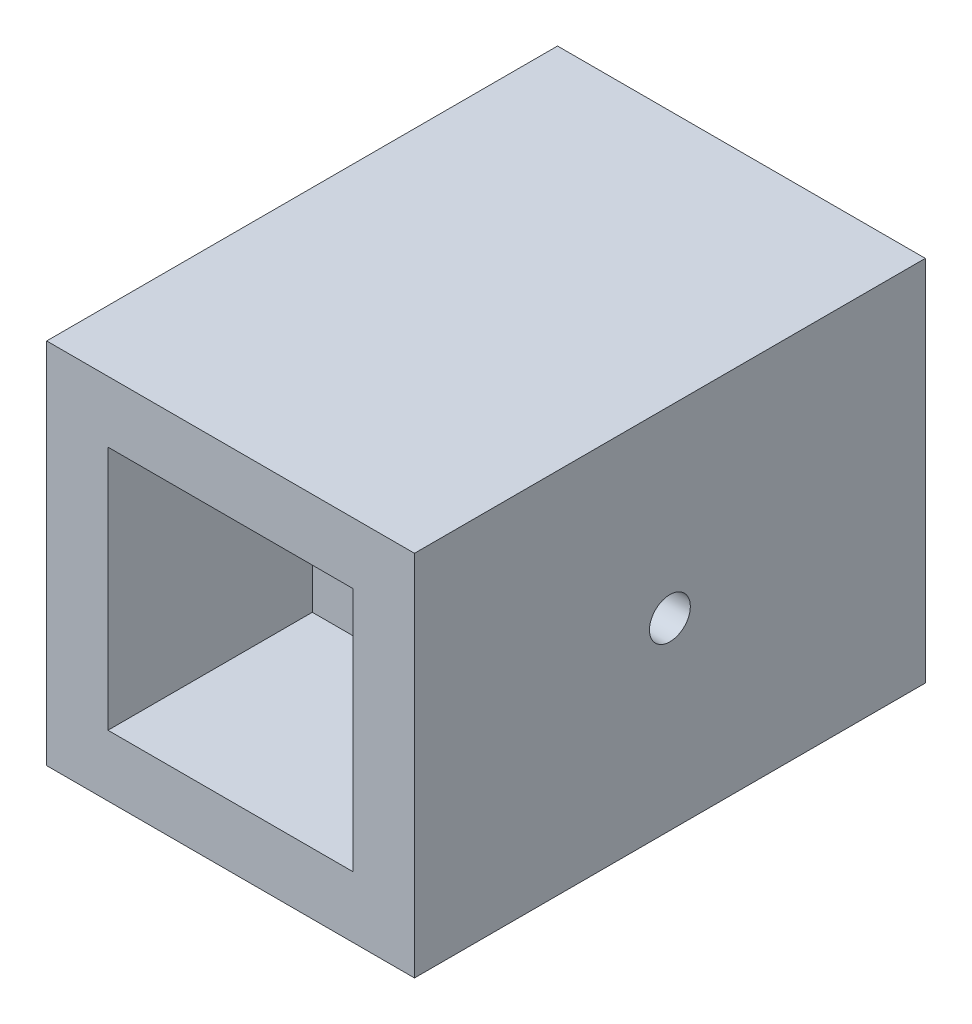
ISO-10303-21;
HEADER;
FILE_DESCRIPTION(('STEP AP214'),'2;1');
FILE_NAME('part.step','',(''),(''),'','','');
FILE_SCHEMA(('AUTOMOTIVE_DESIGN { 1 0 10303 214 1 1 1 1 }'));
ENDSEC;
DATA;
#1=APPLICATION_CONTEXT('core data for automotive mechanical design processes');
#2=APPLICATION_PROTOCOL_DEFINITION('international standard','automotive_design',2000,#1);
#3=PRODUCT_CONTEXT('',#1,'mechanical');
#4=PRODUCT('Part','Part','',(#3));
#5=PRODUCT_RELATED_PRODUCT_CATEGORY('part','',(#4));
#6=PRODUCT_DEFINITION_FORMATION('','',#4);
#7=PRODUCT_DEFINITION_CONTEXT('part definition',#1,'design');
#8=PRODUCT_DEFINITION('design','',#6,#7);
#9=PRODUCT_DEFINITION_SHAPE('','',#8);
#10=(LENGTH_UNIT() NAMED_UNIT(*) SI_UNIT(.MILLI.,.METRE.));
#11=(NAMED_UNIT(*) PLANE_ANGLE_UNIT() SI_UNIT($,.RADIAN.));
#12=(NAMED_UNIT(*) SI_UNIT($,.STERADIAN.) SOLID_ANGLE_UNIT());
#13=UNCERTAINTY_MEASURE_WITH_UNIT(LENGTH_MEASURE(1.E-05),#10,'distance_accuracy_value','');
#14=(GEOMETRIC_REPRESENTATION_CONTEXT(3) GLOBAL_UNCERTAINTY_ASSIGNED_CONTEXT((#13)) GLOBAL_UNIT_ASSIGNED_CONTEXT((#10,
#11,#12)) REPRESENTATION_CONTEXT('',''));
#15=CARTESIAN_POINT('',(0.,0.,0.));
#16=DIRECTION('',(0.,0.,1.));
#17=DIRECTION('',(1.,0.,0.));
#18=AXIS2_PLACEMENT_3D('',#15,#16,#17);
#19=CARTESIAN_POINT('',(0.,0.,25.));
#20=DIRECTION('',(1.,0.,0.));
#21=DIRECTION('',(0.,0.,-1.));
#22=AXIS2_PLACEMENT_3D('',#19,#20,#21);
#23=PLANE('',#22);
#24=CARTESIAN_POINT('',(0.,9.,12.5));
#25=DIRECTION('',(1.,0.,0.));
#26=DIRECTION('',(0.,0.,-1.));
#27=AXIS2_PLACEMENT_3D('',#24,#25,#26);
#28=CIRCLE('',#27,1.);
#29=CARTESIAN_POINT('',(0.,9.,11.5));
#30=VERTEX_POINT('',#29);
#31=EDGE_CURVE('E168',#30,#30,#28,.T.);
#32=ORIENTED_EDGE('',*,*,#31,.T.);
#33=EDGE_LOOP('',(#32));
#34=FACE_BOUND('',#33,.T.);
#35=DIRECTION('',(0.,-1.,0.));
#36=VECTOR('',#35,1.);
#37=CARTESIAN_POINT('',(0.,0.,0.));
#38=LINE('',#37,#36);
#39=CARTESIAN_POINT('',(0.,18.,0.));
#40=VERTEX_POINT('',#39);
#41=CARTESIAN_POINT('',(0.,0.,0.));
#42=VERTEX_POINT('',#41);
#43=EDGE_CURVE('E216',#40,#42,#38,.T.);
#44=ORIENTED_EDGE('',*,*,#43,.T.);
#45=DIRECTION('',(0.,0.,-1.));
#46=VECTOR('',#45,1.);
#47=CARTESIAN_POINT('',(0.,0.,25.));
#48=LINE('',#47,#46);
#49=CARTESIAN_POINT('',(0.,0.,25.));
#50=VERTEX_POINT('',#49);
#51=EDGE_CURVE('E11',#50,#42,#48,.T.);
#52=ORIENTED_EDGE('',*,*,#51,.F.);
#53=DIRECTION('',(0.,-1.,0.));
#54=VECTOR('',#53,1.);
#55=CARTESIAN_POINT('',(0.,0.,25.));
#56=LINE('',#55,#54);
#57=CARTESIAN_POINT('',(0.,18.,25.));
#58=VERTEX_POINT('',#57);
#59=EDGE_CURVE('E225',#58,#50,#56,.T.);
#60=ORIENTED_EDGE('',*,*,#59,.F.);
#61=DIRECTION('',(0.,0.,-1.));
#62=VECTOR('',#61,1.);
#63=CARTESIAN_POINT('',(0.,18.,25.));
#64=LINE('',#63,#62);
#65=EDGE_CURVE('E239',#58,#40,#64,.T.);
#66=ORIENTED_EDGE('',*,*,#65,.T.);
#67=EDGE_LOOP('',(#44,#52,#60,#66));
#68=FACE_BOUND('',#67,.T.);
#69=ADVANCED_FACE('F39',(#34,#68),#23,.F.);
#70=CARTESIAN_POINT('',(0.,0.,25.));
#71=DIRECTION('',(0.,1.,0.));
#72=DIRECTION('',(0.,0.,1.));
#73=AXIS2_PLACEMENT_3D('',#70,#71,#72);
#74=PLANE('',#73);
#75=DIRECTION('',(1.,0.,0.));
#76=VECTOR('',#75,1.);
#77=CARTESIAN_POINT('',(0.,0.,0.));
#78=LINE('',#77,#76);
#79=CARTESIAN_POINT('',(18.,0.,0.));
#80=VERTEX_POINT('',#79);
#81=EDGE_CURVE('E243',#42,#80,#78,.T.);
#82=ORIENTED_EDGE('',*,*,#81,.T.);
#83=DIRECTION('',(0.,0.,-1.));
#84=VECTOR('',#83,1.);
#85=CARTESIAN_POINT('',(18.,0.,25.));
#86=LINE('',#85,#84);
#87=CARTESIAN_POINT('',(18.,0.,25.));
#88=VERTEX_POINT('',#87);
#89=EDGE_CURVE('E47',#88,#80,#86,.T.);
#90=ORIENTED_EDGE('',*,*,#89,.F.);
#91=DIRECTION('',(1.,0.,0.));
#92=VECTOR('',#91,1.);
#93=CARTESIAN_POINT('',(0.,0.,25.));
#94=LINE('',#93,#92);
#95=EDGE_CURVE('E229',#50,#88,#94,.T.);
#96=ORIENTED_EDGE('',*,*,#95,.F.);
#97=ORIENTED_EDGE('',*,*,#51,.T.);
#98=EDGE_LOOP('',(#82,#90,#96,#97));
#99=FACE_BOUND('',#98,.T.);
#100=ADVANCED_FACE('F279',(#99),#74,.F.);
#101=CARTESIAN_POINT('',(18.,0.,25.));
#102=DIRECTION('',(-1.,0.,0.));
#103=DIRECTION('',(0.,0.,1.));
#104=AXIS2_PLACEMENT_3D('',#101,#102,#103);
#105=PLANE('',#104);
#106=CARTESIAN_POINT('',(18.,9.,12.5));
#107=DIRECTION('',(1.,0.,0.));
#108=DIRECTION('',(0.,0.,-1.));
#109=AXIS2_PLACEMENT_3D('',#106,#107,#108);
#110=CIRCLE('',#109,1.);
#111=CARTESIAN_POINT('',(18.,9.,11.5));
#112=VERTEX_POINT('',#111);
#113=EDGE_CURVE('E158',#112,#112,#110,.T.);
#114=ORIENTED_EDGE('',*,*,#113,.F.);
#115=EDGE_LOOP('',(#114));
#116=FACE_BOUND('',#115,.T.);
#117=DIRECTION('',(0.,1.,0.));
#118=VECTOR('',#117,1.);
#119=CARTESIAN_POINT('',(18.,0.,0.));
#120=LINE('',#119,#118);
#121=CARTESIAN_POINT('',(18.,18.,0.));
#122=VERTEX_POINT('',#121);
#123=EDGE_CURVE('E246',#80,#122,#120,.T.);
#124=ORIENTED_EDGE('',*,*,#123,.T.);
#125=DIRECTION('',(0.,0.,-1.));
#126=VECTOR('',#125,1.);
#127=CARTESIAN_POINT('',(18.,18.,25.));
#128=LINE('',#127,#126);
#129=CARTESIAN_POINT('',(18.,18.,25.));
#130=VERTEX_POINT('',#129);
#131=EDGE_CURVE('E254',#130,#122,#128,.T.);
#132=ORIENTED_EDGE('',*,*,#131,.F.);
#133=DIRECTION('',(0.,1.,0.));
#134=VECTOR('',#133,1.);
#135=CARTESIAN_POINT('',(18.,0.,25.));
#136=LINE('',#135,#134);
#137=EDGE_CURVE('E233',#88,#130,#136,.T.);
#138=ORIENTED_EDGE('',*,*,#137,.F.);
#139=ORIENTED_EDGE('',*,*,#89,.T.);
#140=EDGE_LOOP('',(#124,#132,#138,#139));
#141=FACE_BOUND('',#140,.T.);
#142=ADVANCED_FACE('F263',(#116,#141),#105,.F.);
#143=CARTESIAN_POINT('',(0.,18.,25.));
#144=DIRECTION('',(0.,-1.,0.));
#145=DIRECTION('',(0.,0.,-1.));
#146=AXIS2_PLACEMENT_3D('',#143,#144,#145);
#147=PLANE('',#146);
#148=DIRECTION('',(-1.,0.,0.));
#149=VECTOR('',#148,1.);
#150=CARTESIAN_POINT('',(0.,18.,0.));
#151=LINE('',#150,#149);
#152=EDGE_CURVE('E230',#122,#40,#151,.T.);
#153=ORIENTED_EDGE('',*,*,#152,.T.);
#154=ORIENTED_EDGE('',*,*,#65,.F.);
#155=DIRECTION('',(-1.,0.,0.));
#156=VECTOR('',#155,1.);
#157=CARTESIAN_POINT('',(0.,18.,25.));
#158=LINE('',#157,#156);
#159=EDGE_CURVE('E236',#130,#58,#158,.T.);
#160=ORIENTED_EDGE('',*,*,#159,.F.);
#161=ORIENTED_EDGE('',*,*,#131,.T.);
#162=EDGE_LOOP('',(#153,#154,#160,#161));
#163=FACE_BOUND('',#162,.T.);
#164=ADVANCED_FACE('F272',(#163),#147,.F.);
#165=CARTESIAN_POINT('',(0.,0.,25.));
#166=DIRECTION('',(0.,0.,-1.));
#167=DIRECTION('',(-1.,0.,0.));
#168=AXIS2_PLACEMENT_3D('',#165,#166,#167);
#169=PLANE('',#168);
#170=DIRECTION('',(1.,0.,0.));
#171=VECTOR('',#170,1.);
#172=CARTESIAN_POINT('',(3.,3.,25.));
#173=LINE('',#172,#171);
#174=CARTESIAN_POINT('',(3.,3.,25.));
#175=VERTEX_POINT('',#174);
#176=CARTESIAN_POINT('',(15.,3.,25.));
#177=VERTEX_POINT('',#176);
#178=EDGE_CURVE('E167',#175,#177,#173,.T.);
#179=ORIENTED_EDGE('',*,*,#178,.F.);
#180=DIRECTION('',(0.,-1.,0.));
#181=VECTOR('',#180,1.);
#182=CARTESIAN_POINT('',(3.,3.,25.));
#183=LINE('',#182,#181);
#184=CARTESIAN_POINT('',(3.,15.,25.));
#185=VERTEX_POINT('',#184);
#186=EDGE_CURVE('E54',#185,#175,#183,.T.);
#187=ORIENTED_EDGE('',*,*,#186,.F.);
#188=DIRECTION('',(-1.,0.,0.));
#189=VECTOR('',#188,1.);
#190=CARTESIAN_POINT('',(3.,15.,25.));
#191=LINE('',#190,#189);
#192=CARTESIAN_POINT('',(15.,15.,25.));
#193=VERTEX_POINT('',#192);
#194=EDGE_CURVE('E151',#193,#185,#191,.T.);
#195=ORIENTED_EDGE('',*,*,#194,.F.);
#196=DIRECTION('',(0.,1.,0.));
#197=VECTOR('',#196,1.);
#198=CARTESIAN_POINT('',(15.,3.,25.));
#199=LINE('',#198,#197);
#200=EDGE_CURVE('E155',#177,#193,#199,.T.);
#201=ORIENTED_EDGE('',*,*,#200,.F.);
#202=EDGE_LOOP('',(#179,#187,#195,#201));
#203=FACE_BOUND('',#202,.T.);
#204=ORIENTED_EDGE('',*,*,#59,.T.);
#205=ORIENTED_EDGE('',*,*,#95,.T.);
#206=ORIENTED_EDGE('',*,*,#137,.T.);
#207=ORIENTED_EDGE('',*,*,#159,.T.);
#208=EDGE_LOOP('',(#204,#205,#206,#207));
#209=FACE_BOUND('',#208,.T.);
#210=ADVANCED_FACE('F278',(#203,#209),#169,.F.);
#211=CARTESIAN_POINT('',(0.,0.,0.));
#212=DIRECTION('',(0.,0.,-1.));
#213=DIRECTION('',(-1.,0.,0.));
#214=AXIS2_PLACEMENT_3D('',#211,#212,#213);
#215=PLANE('',#214);
#216=DIRECTION('',(0.,1.,0.));
#217=VECTOR('',#216,1.);
#218=CARTESIAN_POINT('',(3.,3.,0.));
#219=LINE('',#218,#217);
#220=CARTESIAN_POINT('',(3.,3.,0.));
#221=VERTEX_POINT('',#220);
#222=CARTESIAN_POINT('',(3.,15.,0.));
#223=VERTEX_POINT('',#222);
#224=EDGE_CURVE('E62',#221,#223,#219,.T.);
#225=ORIENTED_EDGE('',*,*,#224,.F.);
#226=DIRECTION('',(-1.,0.,0.));
#227=VECTOR('',#226,1.);
#228=CARTESIAN_POINT('',(3.,3.,0.));
#229=LINE('',#228,#227);
#230=CARTESIAN_POINT('',(15.,3.,0.));
#231=VERTEX_POINT('',#230);
#232=EDGE_CURVE('E187',#231,#221,#229,.T.);
#233=ORIENTED_EDGE('',*,*,#232,.F.);
#234=DIRECTION('',(0.,-1.,0.));
#235=VECTOR('',#234,1.);
#236=CARTESIAN_POINT('',(15.,3.,0.));
#237=LINE('',#236,#235);
#238=CARTESIAN_POINT('',(15.,15.,0.));
#239=VERTEX_POINT('',#238);
#240=EDGE_CURVE('E206',#239,#231,#237,.T.);
#241=ORIENTED_EDGE('',*,*,#240,.F.);
#242=DIRECTION('',(1.,0.,0.));
#243=VECTOR('',#242,1.);
#244=CARTESIAN_POINT('',(3.,15.,0.));
#245=LINE('',#244,#243);
#246=EDGE_CURVE('E202',#223,#239,#245,.T.);
#247=ORIENTED_EDGE('',*,*,#246,.F.);
#248=EDGE_LOOP('',(#225,#233,#241,#247));
#249=FACE_BOUND('',#248,.T.);
#250=ORIENTED_EDGE('',*,*,#43,.F.);
#251=ORIENTED_EDGE('',*,*,#152,.F.);
#252=ORIENTED_EDGE('',*,*,#123,.F.);
#253=ORIENTED_EDGE('',*,*,#81,.F.);
#254=EDGE_LOOP('',(#250,#251,#252,#253));
#255=FACE_BOUND('',#254,.T.);
#256=ADVANCED_FACE('F269',(#249,#255),#215,.T.);
#257=CARTESIAN_POINT('',(3.,3.,10.));
#258=DIRECTION('',(-1.,0.,0.));
#259=DIRECTION('',(0.,0.,1.));
#260=AXIS2_PLACEMENT_3D('',#257,#258,#259);
#261=PLANE('',#260);
#262=ORIENTED_EDGE('',*,*,#224,.T.);
#263=DIRECTION('',(0.,0.,-1.));
#264=VECTOR('',#263,1.);
#265=CARTESIAN_POINT('',(3.,15.,10.));
#266=LINE('',#265,#264);
#267=CARTESIAN_POINT('',(3.,15.,10.));
#268=VERTEX_POINT('',#267);
#269=EDGE_CURVE('E199',#268,#223,#266,.T.);
#270=ORIENTED_EDGE('',*,*,#269,.F.);
#271=DIRECTION('',(0.,1.,0.));
#272=VECTOR('',#271,1.);
#273=CARTESIAN_POINT('',(3.,3.,10.));
#274=LINE('',#273,#272);
#275=CARTESIAN_POINT('',(3.,3.,10.));
#276=VERTEX_POINT('',#275);
#277=EDGE_CURVE('E182',#276,#268,#274,.T.);
#278=ORIENTED_EDGE('',*,*,#277,.F.);
#279=DIRECTION('',(0.,0.,-1.));
#280=VECTOR('',#279,1.);
#281=CARTESIAN_POINT('',(3.,3.,10.));
#282=LINE('',#281,#280);
#283=EDGE_CURVE('E213',#276,#221,#282,.T.);
#284=ORIENTED_EDGE('',*,*,#283,.T.);
#285=EDGE_LOOP('',(#262,#270,#278,#284));
#286=FACE_BOUND('',#285,.T.);
#287=ADVANCED_FACE('F293',(#286),#261,.F.);
#288=CARTESIAN_POINT('',(3.,3.,10.));
#289=DIRECTION('',(0.,-1.,0.));
#290=DIRECTION('',(0.,0.,-1.));
#291=AXIS2_PLACEMENT_3D('',#288,#289,#290);
#292=PLANE('',#291);
#293=ORIENTED_EDGE('',*,*,#232,.T.);
#294=ORIENTED_EDGE('',*,*,#283,.F.);
#295=DIRECTION('',(-1.,0.,0.));
#296=VECTOR('',#295,1.);
#297=CARTESIAN_POINT('',(3.,3.,10.));
#298=LINE('',#297,#296);
#299=CARTESIAN_POINT('',(15.,3.,10.));
#300=VERTEX_POINT('',#299);
#301=EDGE_CURVE('E195',#300,#276,#298,.T.);
#302=ORIENTED_EDGE('',*,*,#301,.F.);
#303=DIRECTION('',(0.,0.,-1.));
#304=VECTOR('',#303,1.);
#305=CARTESIAN_POINT('',(15.,3.,10.));
#306=LINE('',#305,#304);
#307=EDGE_CURVE('E217',#300,#231,#306,.T.);
#308=ORIENTED_EDGE('',*,*,#307,.T.);
#309=EDGE_LOOP('',(#293,#294,#302,#308));
#310=FACE_BOUND('',#309,.T.);
#311=ADVANCED_FACE('F300',(#310),#292,.F.);
#312=CARTESIAN_POINT('',(15.,3.,10.));
#313=DIRECTION('',(1.,0.,0.));
#314=DIRECTION('',(0.,0.,-1.));
#315=AXIS2_PLACEMENT_3D('',#312,#313,#314);
#316=PLANE('',#315);
#317=ORIENTED_EDGE('',*,*,#240,.T.);
#318=ORIENTED_EDGE('',*,*,#307,.F.);
#319=DIRECTION('',(0.,-1.,0.));
#320=VECTOR('',#319,1.);
#321=CARTESIAN_POINT('',(15.,3.,10.));
#322=LINE('',#321,#320);
#323=CARTESIAN_POINT('',(15.,15.,10.));
#324=VERTEX_POINT('',#323);
#325=EDGE_CURVE('E191',#324,#300,#322,.T.);
#326=ORIENTED_EDGE('',*,*,#325,.F.);
#327=DIRECTION('',(0.,0.,-1.));
#328=VECTOR('',#327,1.);
#329=CARTESIAN_POINT('',(15.,15.,10.));
#330=LINE('',#329,#328);
#331=EDGE_CURVE('E220',#324,#239,#330,.T.);
#332=ORIENTED_EDGE('',*,*,#331,.T.);
#333=EDGE_LOOP('',(#317,#318,#326,#332));
#334=FACE_BOUND('',#333,.T.);
#335=ADVANCED_FACE('F305',(#334),#316,.F.);
#336=CARTESIAN_POINT('',(3.,15.,10.));
#337=DIRECTION('',(0.,1.,0.));
#338=DIRECTION('',(-1.,0.,0.));
#339=AXIS2_PLACEMENT_3D('',#336,#337,#338);
#340=PLANE('',#339);
#341=ORIENTED_EDGE('',*,*,#246,.T.);
#342=ORIENTED_EDGE('',*,*,#331,.F.);
#343=DIRECTION('',(1.,0.,0.));
#344=VECTOR('',#343,1.);
#345=CARTESIAN_POINT('',(3.,15.,10.));
#346=LINE('',#345,#344);
#347=EDGE_CURVE('E186',#268,#324,#346,.T.);
#348=ORIENTED_EDGE('',*,*,#347,.F.);
#349=ORIENTED_EDGE('',*,*,#269,.T.);
#350=EDGE_LOOP('',(#341,#342,#348,#349));
#351=FACE_BOUND('',#350,.T.);
#352=ADVANCED_FACE('F301',(#351),#340,.F.);
#353=CARTESIAN_POINT('',(0.,0.,10.));
#354=DIRECTION('',(0.,0.,-1.));
#355=DIRECTION('',(-1.,0.,0.));
#356=AXIS2_PLACEMENT_3D('',#353,#354,#355);
#357=PLANE('',#356);
#358=ORIENTED_EDGE('',*,*,#277,.T.);
#359=ORIENTED_EDGE('',*,*,#347,.T.);
#360=ORIENTED_EDGE('',*,*,#325,.T.);
#361=ORIENTED_EDGE('',*,*,#301,.T.);
#362=EDGE_LOOP('',(#358,#359,#360,#361));
#363=FACE_BOUND('',#362,.T.);
#364=ADVANCED_FACE('F304',(#363),#357,.T.);
#365=CARTESIAN_POINT('',(3.,3.,15.));
#366=DIRECTION('',(-1.,0.,0.));
#367=DIRECTION('',(0.,0.,1.));
#368=AXIS2_PLACEMENT_3D('',#365,#366,#367);
#369=PLANE('',#368);
#370=ORIENTED_EDGE('',*,*,#186,.T.);
#371=DIRECTION('',(0.,0.,1.));
#372=VECTOR('',#371,1.);
#373=CARTESIAN_POINT('',(3.,3.,15.));
#374=LINE('',#373,#372);
#375=CARTESIAN_POINT('',(3.,3.,15.));
#376=VERTEX_POINT('',#375);
#377=EDGE_CURVE('E126',#376,#175,#374,.T.);
#378=ORIENTED_EDGE('',*,*,#377,.F.);
#379=DIRECTION('',(0.,-1.,0.));
#380=VECTOR('',#379,1.);
#381=CARTESIAN_POINT('',(3.,3.,15.));
#382=LINE('',#381,#380);
#383=CARTESIAN_POINT('',(3.,15.,15.));
#384=VERTEX_POINT('',#383);
#385=EDGE_CURVE('E130',#384,#376,#382,.T.);
#386=ORIENTED_EDGE('',*,*,#385,.F.);
#387=DIRECTION('',(0.,0.,1.));
#388=VECTOR('',#387,1.);
#389=CARTESIAN_POINT('',(3.,15.,15.));
#390=LINE('',#389,#388);
#391=EDGE_CURVE('E174',#384,#185,#390,.T.);
#392=ORIENTED_EDGE('',*,*,#391,.T.);
#393=EDGE_LOOP('',(#370,#378,#386,#392));
#394=FACE_BOUND('',#393,.T.);
#395=ADVANCED_FACE('F128',(#394),#369,.F.);
#396=CARTESIAN_POINT('',(3.,15.,15.));
#397=DIRECTION('',(0.,1.,0.));
#398=DIRECTION('',(0.,0.,1.));
#399=AXIS2_PLACEMENT_3D('',#396,#397,#398);
#400=PLANE('',#399);
#401=ORIENTED_EDGE('',*,*,#194,.T.);
#402=ORIENTED_EDGE('',*,*,#391,.F.);
#403=DIRECTION('',(-1.,0.,0.));
#404=VECTOR('',#403,1.);
#405=CARTESIAN_POINT('',(3.,15.,15.));
#406=LINE('',#405,#404);
#407=CARTESIAN_POINT('',(15.,15.,15.));
#408=VERTEX_POINT('',#407);
#409=EDGE_CURVE('E137',#408,#384,#406,.T.);
#410=ORIENTED_EDGE('',*,*,#409,.F.);
#411=DIRECTION('',(0.,0.,1.));
#412=VECTOR('',#411,1.);
#413=CARTESIAN_POINT('',(15.,15.,15.));
#414=LINE('',#413,#412);
#415=EDGE_CURVE('E177',#408,#193,#414,.T.);
#416=ORIENTED_EDGE('',*,*,#415,.T.);
#417=EDGE_LOOP('',(#401,#402,#410,#416));
#418=FACE_BOUND('',#417,.T.);
#419=ADVANCED_FACE('F318',(#418),#400,.F.);
#420=CARTESIAN_POINT('',(15.,3.,15.));
#421=DIRECTION('',(1.,0.,0.));
#422=DIRECTION('',(0.,0.,-1.));
#423=AXIS2_PLACEMENT_3D('',#420,#421,#422);
#424=PLANE('',#423);
#425=ORIENTED_EDGE('',*,*,#200,.T.);
#426=ORIENTED_EDGE('',*,*,#415,.F.);
#427=DIRECTION('',(0.,1.,0.));
#428=VECTOR('',#427,1.);
#429=CARTESIAN_POINT('',(15.,3.,15.));
#430=LINE('',#429,#428);
#431=CARTESIAN_POINT('',(15.,3.,15.));
#432=VERTEX_POINT('',#431);
#433=EDGE_CURVE('E146',#432,#408,#430,.T.);
#434=ORIENTED_EDGE('',*,*,#433,.F.);
#435=DIRECTION('',(0.,0.,1.));
#436=VECTOR('',#435,1.);
#437=CARTESIAN_POINT('',(15.,3.,15.));
#438=LINE('',#437,#436);
#439=EDGE_CURVE('E136',#432,#177,#438,.T.);
#440=ORIENTED_EDGE('',*,*,#439,.T.);
#441=EDGE_LOOP('',(#425,#426,#434,#440));
#442=FACE_BOUND('',#441,.T.);
#443=ADVANCED_FACE('F321',(#442),#424,.F.);
#444=CARTESIAN_POINT('',(3.,3.,15.));
#445=DIRECTION('',(0.,-1.,0.));
#446=DIRECTION('',(0.,0.,-1.));
#447=AXIS2_PLACEMENT_3D('',#444,#445,#446);
#448=PLANE('',#447);
#449=ORIENTED_EDGE('',*,*,#178,.T.);
#450=ORIENTED_EDGE('',*,*,#439,.F.);
#451=DIRECTION('',(1.,0.,0.));
#452=VECTOR('',#451,1.);
#453=CARTESIAN_POINT('',(3.,3.,15.));
#454=LINE('',#453,#452);
#455=EDGE_CURVE('E140',#376,#432,#454,.T.);
#456=ORIENTED_EDGE('',*,*,#455,.F.);
#457=ORIENTED_EDGE('',*,*,#377,.T.);
#458=EDGE_LOOP('',(#449,#450,#456,#457));
#459=FACE_BOUND('',#458,.T.);
#460=ADVANCED_FACE('F141',(#459),#448,.F.);
#461=CARTESIAN_POINT('',(0.,0.,15.));
#462=DIRECTION('',(0.,0.,-1.));
#463=DIRECTION('',(-1.,0.,0.));
#464=AXIS2_PLACEMENT_3D('',#461,#462,#463);
#465=PLANE('',#464);
#466=ORIENTED_EDGE('',*,*,#385,.T.);
#467=ORIENTED_EDGE('',*,*,#455,.T.);
#468=ORIENTED_EDGE('',*,*,#433,.T.);
#469=ORIENTED_EDGE('',*,*,#409,.T.);
#470=EDGE_LOOP('',(#466,#467,#468,#469));
#471=FACE_BOUND('',#470,.T.);
#472=ADVANCED_FACE('F148',(#471),#465,.F.);
#473=CARTESIAN_POINT('',(0.,9.,12.5));
#474=DIRECTION('',(1.,0.,0.));
#475=DIRECTION('',(0.,0.,-1.));
#476=AXIS2_PLACEMENT_3D('',#473,#474,#475);
#477=CYLINDRICAL_SURFACE('',#476,1.);
#478=ORIENTED_EDGE('',*,*,#31,.F.);
#479=EDGE_LOOP('',(#478));
#480=FACE_BOUND('',#479,.T.);
#481=ORIENTED_EDGE('',*,*,#113,.T.);
#482=EDGE_LOOP('',(#481));
#483=FACE_BOUND('',#482,.T.);
#484=ADVANCED_FACE('F330',(#480,#483),#477,.F.);
#485=CLOSED_SHELL('',(#69,#100,#142,#164,#210,#256,#287,#311,#335,#352,#364,#395,#419,#443,#460,
#472,#484));
#486=MANIFOLD_SOLID_BREP('B2',#485);
#487=ADVANCED_BREP_SHAPE_REPRESENTATION('',(#18,#486),#14);
#488=SHAPE_DEFINITION_REPRESENTATION(#9,#487);
ENDSEC;
END-ISO-10303-21;
